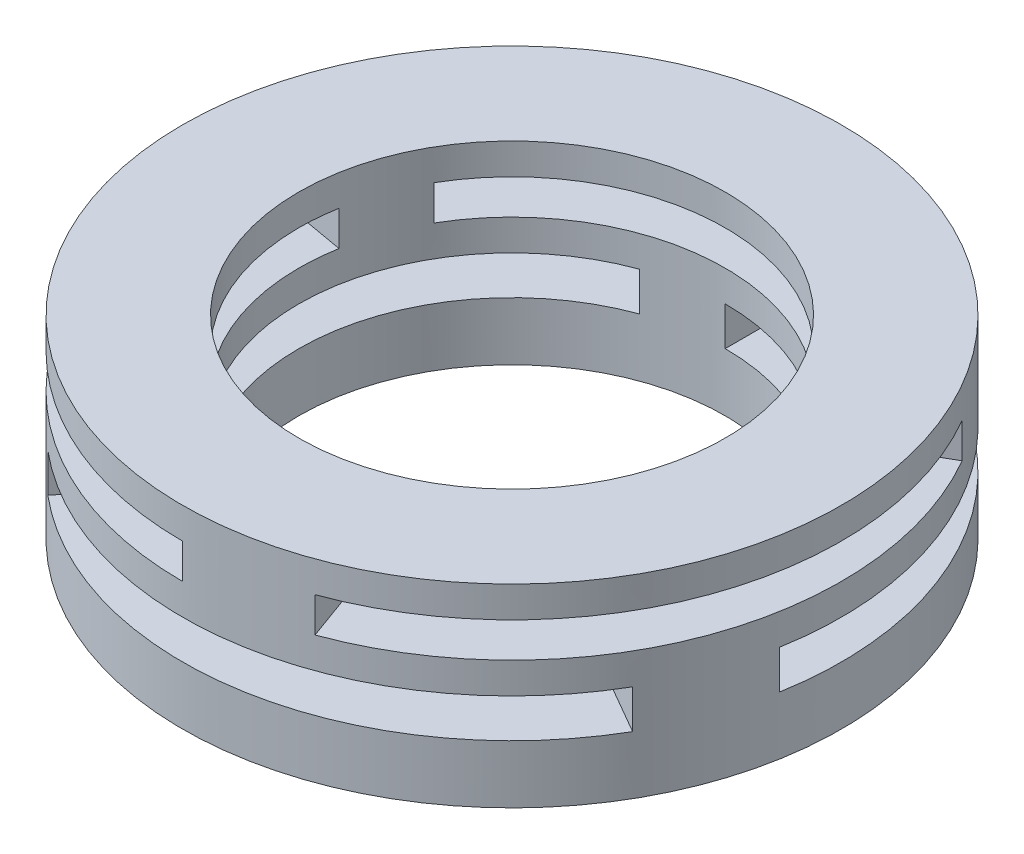
ISO-10303-21;
HEADER;
FILE_DESCRIPTION(('STEP AP214'),'2;1');
FILE_NAME('part.step','',(''),(''),'','','');
FILE_SCHEMA(('AUTOMOTIVE_DESIGN { 1 0 10303 214 1 1 1 1 }'));
ENDSEC;
DATA;
#1=APPLICATION_CONTEXT('core data for automotive mechanical design processes');
#2=APPLICATION_PROTOCOL_DEFINITION('international standard','automotive_design',2000,#1);
#3=PRODUCT_CONTEXT('',#1,'mechanical');
#4=PRODUCT('Part','Part','',(#3));
#5=PRODUCT_RELATED_PRODUCT_CATEGORY('part','',(#4));
#6=PRODUCT_DEFINITION_FORMATION('','',#4);
#7=PRODUCT_DEFINITION_CONTEXT('part definition',#1,'design');
#8=PRODUCT_DEFINITION('design','',#6,#7);
#9=PRODUCT_DEFINITION_SHAPE('','',#8);
#10=(LENGTH_UNIT() NAMED_UNIT(*) SI_UNIT(.MILLI.,.METRE.));
#11=(NAMED_UNIT(*) PLANE_ANGLE_UNIT() SI_UNIT($,.RADIAN.));
#12=(NAMED_UNIT(*) SI_UNIT($,.STERADIAN.) SOLID_ANGLE_UNIT());
#13=UNCERTAINTY_MEASURE_WITH_UNIT(LENGTH_MEASURE(1.E-05),#10,'distance_accuracy_value','');
#14=(GEOMETRIC_REPRESENTATION_CONTEXT(3) GLOBAL_UNCERTAINTY_ASSIGNED_CONTEXT((#13)) GLOBAL_UNIT_ASSIGNED_CONTEXT((#10,
#11,#12)) REPRESENTATION_CONTEXT('',''));
#15=CARTESIAN_POINT('',(0.,0.,0.));
#16=DIRECTION('',(0.,0.,1.));
#17=DIRECTION('',(1.,0.,0.));
#18=AXIS2_PLACEMENT_3D('',#15,#16,#17);
#19=CARTESIAN_POINT('',(3.86795134082924E-13,-112.760074912511,0.));
#20=DIRECTION('',(0.,1.,0.));
#21=DIRECTION('',(-1.,0.,0.));
#22=AXIS2_PLACEMENT_3D('',#19,#20,#21);
#23=CYLINDRICAL_SURFACE('',#22,5.50000000000001);
#24=DIRECTION('',(0.,1.,0.));
#25=VECTOR('',#24,1.);
#26=CARTESIAN_POINT('',(4.25264361886186E-13,-112.760074912511,5.50000000000001));
#27=LINE('',#26,#25);
#28=CARTESIAN_POINT('',(0.,4.19999999999998,5.50000000000001));
#29=VERTEX_POINT('',#28);
#30=CARTESIAN_POINT('',(0.,3.29999999999997,5.50000000000001));
#31=VERTEX_POINT('',#30);
#32=EDGE_CURVE('E239',#29,#31,#27,.F.);
#33=ORIENTED_EDGE('',*,*,#32,.F.);
#34=CARTESIAN_POINT('',(0.,4.19999999999998,0.));
#35=DIRECTION('',(0.,1.,0.));
#36=DIRECTION('',(-1.,0.,0.));
#37=AXIS2_PLACEMENT_3D('',#34,#35,#36);
#38=CIRCLE('',#37,5.50000000000001);
#39=CARTESIAN_POINT('',(-5.41644264156717,4.19999999999996,-0.955064977168101));
#40=VERTEX_POINT('',#39);
#41=EDGE_CURVE('E232',#29,#40,#38,.F.);
#42=ORIENTED_EDGE('',*,*,#41,.T.);
#43=DIRECTION('',(0.,1.,0.));
#44=VECTOR('',#43,1.);
#45=CARTESIAN_POINT('',(-5.41644264156677,-112.760074912511,-0.955064977168101));
#46=LINE('',#45,#44);
#47=CARTESIAN_POINT('',(-5.41644264156717,3.29999999999995,-0.955064977168101));
#48=VERTEX_POINT('',#47);
#49=EDGE_CURVE('E207',#48,#40,#46,.T.);
#50=ORIENTED_EDGE('',*,*,#49,.F.);
#51=CARTESIAN_POINT('',(0.,3.29999999999997,0.));
#52=DIRECTION('',(0.,1.,0.));
#53=DIRECTION('',(-1.,0.,0.));
#54=AXIS2_PLACEMENT_3D('',#51,#52,#53);
#55=CIRCLE('',#54,5.50000000000001);
#56=EDGE_CURVE('E227',#31,#48,#55,.F.);
#57=ORIENTED_EDGE('',*,*,#56,.F.);
#58=EDGE_LOOP('',(#33,#42,#50,#57));
#59=FACE_BOUND('',#58,.T.);
#60=DIRECTION('',(0.,1.,0.));
#61=VECTOR('',#60,1.);
#62=CARTESIAN_POINT('',(-4.76313972081404,-112.760074912511,-2.74999999999999));
#63=LINE('',#62,#61);
#64=CARTESIAN_POINT('',(-4.76313972081444,4.19999999999996,-2.74999999999999));
#65=VERTEX_POINT('',#64);
#66=CARTESIAN_POINT('',(-4.76313972081444,3.29999999999995,-2.74999999999999));
#67=VERTEX_POINT('',#66);
#68=EDGE_CURVE('E279',#65,#67,#63,.F.);
#69=ORIENTED_EDGE('',*,*,#68,.F.);
#70=CARTESIAN_POINT('',(0.,4.19999999999998,0.));
#71=DIRECTION('',(0.,1.,0.));
#72=DIRECTION('',(-1.,0.,0.));
#73=AXIS2_PLACEMENT_3D('',#70,#71,#72);
#74=CIRCLE('',#73,5.50000000000001);
#75=CARTESIAN_POINT('',(3.53533185327596,4.19999999999999,-4.21324443715438));
#76=VERTEX_POINT('',#75);
#77=EDGE_CURVE('E275',#65,#76,#74,.F.);
#78=ORIENTED_EDGE('',*,*,#77,.T.);
#79=DIRECTION('',(0.,1.,0.));
#80=VECTOR('',#79,1.);
#81=CARTESIAN_POINT('',(3.53533185327636,-112.760074912511,-4.21324443715438));
#82=LINE('',#81,#80);
#83=CARTESIAN_POINT('',(3.53533185327597,3.29999999999998,-4.21324443715438));
#84=VERTEX_POINT('',#83);
#85=EDGE_CURVE('E283',#84,#76,#82,.T.);
#86=ORIENTED_EDGE('',*,*,#85,.F.);
#87=CARTESIAN_POINT('',(0.,3.29999999999997,0.));
#88=DIRECTION('',(0.,1.,0.));
#89=DIRECTION('',(-1.,0.,0.));
#90=AXIS2_PLACEMENT_3D('',#87,#88,#89);
#91=CIRCLE('',#90,5.50000000000001);
#92=EDGE_CURVE('E272',#67,#84,#91,.F.);
#93=ORIENTED_EDGE('',*,*,#92,.F.);
#94=EDGE_LOOP('',(#69,#78,#86,#93));
#95=FACE_BOUND('',#94,.T.);
#96=DIRECTION('',(0.,1.,0.));
#97=VECTOR('',#96,1.);
#98=CARTESIAN_POINT('',(4.76313972081481,-112.760074912511,-2.74999999999999));
#99=LINE('',#98,#97);
#100=CARTESIAN_POINT('',(4.76313972081441,4.2,-2.74999999999999));
#101=VERTEX_POINT('',#100);
#102=CARTESIAN_POINT('',(4.76313972081442,3.29999999999999,-2.74999999999999));
#103=VERTEX_POINT('',#102);
#104=EDGE_CURVE('E321',#101,#103,#99,.F.);
#105=ORIENTED_EDGE('',*,*,#104,.F.);
#106=CARTESIAN_POINT('',(0.,4.19999999999998,0.));
#107=DIRECTION('',(0.,1.,0.));
#108=DIRECTION('',(-1.,0.,0.));
#109=AXIS2_PLACEMENT_3D('',#106,#107,#108);
#110=CIRCLE('',#109,5.50000000000001);
#111=CARTESIAN_POINT('',(1.88111078829114,4.19999999999999,5.16830941432251));
#112=VERTEX_POINT('',#111);
#113=EDGE_CURVE('E317',#101,#112,#110,.F.);
#114=ORIENTED_EDGE('',*,*,#113,.T.);
#115=DIRECTION('',(0.,1.,0.));
#116=VECTOR('',#115,1.);
#117=CARTESIAN_POINT('',(1.88111078829154,-112.760074912511,5.16830941432251));
#118=LINE('',#117,#116);
#119=CARTESIAN_POINT('',(1.88111078829114,3.29999999999998,5.16830941432251));
#120=VERTEX_POINT('',#119);
#121=EDGE_CURVE('E325',#120,#112,#118,.T.);
#122=ORIENTED_EDGE('',*,*,#121,.F.);
#123=CARTESIAN_POINT('',(0.,3.29999999999997,0.));
#124=DIRECTION('',(0.,1.,0.));
#125=DIRECTION('',(-1.,0.,0.));
#126=AXIS2_PLACEMENT_3D('',#123,#124,#125);
#127=CIRCLE('',#126,5.50000000000001);
#128=EDGE_CURVE('E314',#103,#120,#127,.F.);
#129=ORIENTED_EDGE('',*,*,#128,.F.);
#130=EDGE_LOOP('',(#105,#114,#122,#129));
#131=FACE_BOUND('',#130,.T.);
#132=DIRECTION('',(0.,-1.,0.));
#133=VECTOR('',#132,1.);
#134=CARTESIAN_POINT('',(4.76313972081444,2.49999999999999,2.74999999999996));
#135=LINE('',#134,#133);
#136=CARTESIAN_POINT('',(4.76313972081444,2.49999999999999,2.74999999999996));
#137=VERTEX_POINT('',#136);
#138=CARTESIAN_POINT('',(4.76313972081444,1.49999999999999,2.74999999999996));
#139=VERTEX_POINT('',#138);
#140=EDGE_CURVE('E364',#137,#139,#135,.T.);
#141=ORIENTED_EDGE('',*,*,#140,.F.);
#142=CARTESIAN_POINT('',(0.,2.49999999999998,0.));
#143=DIRECTION('',(0.,-1.,0.));
#144=DIRECTION('',(0.499999999999992,0.,-0.866025403784443));
#145=AXIS2_PLACEMENT_3D('',#142,#143,#144);
#146=CIRCLE('',#145,5.50000000000002);
#147=CARTESIAN_POINT('',(-3.53533185327593,2.49999999999996,4.21324443715444));
#148=VERTEX_POINT('',#147);
#149=EDGE_CURVE('E337',#137,#148,#146,.T.);
#150=ORIENTED_EDGE('',*,*,#149,.T.);
#151=DIRECTION('',(0.,-1.,0.));
#152=VECTOR('',#151,1.);
#153=CARTESIAN_POINT('',(-3.53533185327593,2.49999999999996,4.21324443715444));
#154=LINE('',#153,#152);
#155=CARTESIAN_POINT('',(-3.53533185327593,1.49999999999996,4.21324443715444));
#156=VERTEX_POINT('',#155);
#157=EDGE_CURVE('E360',#148,#156,#154,.T.);
#158=ORIENTED_EDGE('',*,*,#157,.T.);
#159=CARTESIAN_POINT('',(0.,1.49999999999998,0.));
#160=DIRECTION('',(0.,-1.,0.));
#161=DIRECTION('',(0.499999999999992,0.,-0.866025403784443));
#162=AXIS2_PLACEMENT_3D('',#159,#160,#161);
#163=CIRCLE('',#162,5.50000000000002);
#164=EDGE_CURVE('E352',#139,#156,#163,.T.);
#165=ORIENTED_EDGE('',*,*,#164,.F.);
#166=EDGE_LOOP('',(#141,#150,#158,#165));
#167=FACE_BOUND('',#166,.T.);
#168=DIRECTION('',(0.,-1.,0.));
#169=VECTOR('',#168,1.);
#170=CARTESIAN_POINT('',(-4.76313972081442,2.49999999999996,2.75000000000003));
#171=LINE('',#170,#169);
#172=CARTESIAN_POINT('',(-4.76313972081442,2.49999999999996,2.75000000000003));
#173=VERTEX_POINT('',#172);
#174=CARTESIAN_POINT('',(-4.76313972081441,1.49999999999996,2.75000000000003));
#175=VERTEX_POINT('',#174);
#176=EDGE_CURVE('E407',#173,#175,#171,.T.);
#177=ORIENTED_EDGE('',*,*,#176,.F.);
#178=CARTESIAN_POINT('',(0.,2.49999999999998,0.));
#179=DIRECTION('',(0.,-1.,0.));
#180=DIRECTION('',(0.500000000000004,0.,0.866025403784436));
#181=AXIS2_PLACEMENT_3D('',#178,#179,#180);
#182=CIRCLE('',#181,5.50000000000002);
#183=CARTESIAN_POINT('',(-1.88111078829124,2.49999999999997,-5.1683094143225));
#184=VERTEX_POINT('',#183);
#185=EDGE_CURVE('E380',#173,#184,#182,.T.);
#186=ORIENTED_EDGE('',*,*,#185,.T.);
#187=DIRECTION('',(0.,-1.,0.));
#188=VECTOR('',#187,1.);
#189=CARTESIAN_POINT('',(-1.88111078829124,2.49999999999997,-5.1683094143225));
#190=LINE('',#189,#188);
#191=CARTESIAN_POINT('',(-1.88111078829123,1.49999999999997,-5.1683094143225));
#192=VERTEX_POINT('',#191);
#193=EDGE_CURVE('E403',#184,#192,#190,.T.);
#194=ORIENTED_EDGE('',*,*,#193,.T.);
#195=CARTESIAN_POINT('',(0.,1.49999999999998,0.));
#196=DIRECTION('',(0.,-1.,0.));
#197=DIRECTION('',(0.500000000000004,0.,0.866025403784436));
#198=AXIS2_PLACEMENT_3D('',#195,#196,#197);
#199=CIRCLE('',#198,5.50000000000002);
#200=EDGE_CURVE('E395',#175,#192,#199,.T.);
#201=ORIENTED_EDGE('',*,*,#200,.F.);
#202=EDGE_LOOP('',(#177,#186,#194,#201));
#203=FACE_BOUND('',#202,.T.);
#204=DIRECTION('',(0.,-1.,0.));
#205=VECTOR('',#204,1.);
#206=CARTESIAN_POINT('',(0.,2.49999999999998,-5.50000000000002));
#207=LINE('',#206,#205);
#208=CARTESIAN_POINT('',(0.,2.49999999999998,-5.50000000000002));
#209=VERTEX_POINT('',#208);
#210=CARTESIAN_POINT('',(0.,1.49999999999997,-5.50000000000001));
#211=VERTEX_POINT('',#210);
#212=EDGE_CURVE('E450',#209,#211,#207,.T.);
#213=ORIENTED_EDGE('',*,*,#212,.F.);
#214=CARTESIAN_POINT('',(0.,2.49999999999998,0.));
#215=DIRECTION('',(0.,-1.,0.));
#216=DIRECTION('',(-1.,0.,0.));
#217=AXIS2_PLACEMENT_3D('',#214,#215,#216);
#218=CIRCLE('',#217,5.50000000000002);
#219=CARTESIAN_POINT('',(5.41644264156716,2.49999999999999,0.955064977168098));
#220=VERTEX_POINT('',#219);
#221=EDGE_CURVE('E423',#209,#220,#218,.T.);
#222=ORIENTED_EDGE('',*,*,#221,.T.);
#223=DIRECTION('',(0.,-1.,0.));
#224=VECTOR('',#223,1.);
#225=CARTESIAN_POINT('',(5.41644264156716,2.49999999999999,0.955064977168098));
#226=LINE('',#225,#224);
#227=CARTESIAN_POINT('',(5.41644264156716,1.49999999999999,0.955064977168098));
#228=VERTEX_POINT('',#227);
#229=EDGE_CURVE('E446',#220,#228,#226,.T.);
#230=ORIENTED_EDGE('',*,*,#229,.T.);
#231=CARTESIAN_POINT('',(0.,1.49999999999998,0.));
#232=DIRECTION('',(0.,-1.,0.));
#233=DIRECTION('',(-1.,0.,0.));
#234=AXIS2_PLACEMENT_3D('',#231,#232,#233);
#235=CIRCLE('',#234,5.50000000000002);
#236=EDGE_CURVE('E438',#211,#228,#235,.T.);
#237=ORIENTED_EDGE('',*,*,#236,.F.);
#238=EDGE_LOOP('',(#213,#222,#230,#237));
#239=FACE_BOUND('',#238,.T.);
#240=CARTESIAN_POINT('',(0.,0.,0.));
#241=DIRECTION('',(0.,1.,0.));
#242=DIRECTION('',(-1.,0.,0.));
#243=AXIS2_PLACEMENT_3D('',#240,#241,#242);
#244=CIRCLE('',#243,5.5);
#245=CARTESIAN_POINT('',(-5.5,0.,0.));
#246=VERTEX_POINT('',#245);
#247=EDGE_CURVE('E11',#246,#246,#244,.T.);
#248=ORIENTED_EDGE('',*,*,#247,.F.);
#249=EDGE_LOOP('',(#248));
#250=FACE_BOUND('',#249,.T.);
#251=CARTESIAN_POINT('',(0.,4.99999999999999,0.));
#252=DIRECTION('',(0.,1.,0.));
#253=DIRECTION('',(-1.,0.,0.));
#254=AXIS2_PLACEMENT_3D('',#251,#252,#253);
#255=CIRCLE('',#254,5.50000000000002);
#256=CARTESIAN_POINT('',(-5.50000000000003,4.99999999999997,0.));
#257=VERTEX_POINT('',#256);
#258=EDGE_CURVE('E457',#257,#257,#255,.T.);
#259=ORIENTED_EDGE('',*,*,#258,.T.);
#260=EDGE_LOOP('',(#259));
#261=FACE_BOUND('',#260,.T.);
#262=ADVANCED_FACE('F43',(#59,#95,#131,#167,#203,#239,#250,#261),#23,.F.);
#263=CARTESIAN_POINT('',(5.5,0.,0.));
#264=DIRECTION('',(0.,1.,0.));
#265=DIRECTION('',(-1.,0.,0.));
#266=AXIS2_PLACEMENT_3D('',#263,#264,#265);
#267=PLANE('',#266);
#268=CARTESIAN_POINT('',(0.,0.,0.));
#269=DIRECTION('',(0.,1.,0.));
#270=DIRECTION('',(-1.,0.,0.));
#271=AXIS2_PLACEMENT_3D('',#268,#269,#270);
#272=CIRCLE('',#271,8.5);
#273=CARTESIAN_POINT('',(-8.5,0.,0.));
#274=VERTEX_POINT('',#273);
#275=EDGE_CURVE('E51',#274,#274,#272,.T.);
#276=ORIENTED_EDGE('',*,*,#275,.F.);
#277=EDGE_LOOP('',(#276));
#278=FACE_BOUND('',#277,.T.);
#279=ORIENTED_EDGE('',*,*,#247,.T.);
#280=EDGE_LOOP('',(#279));
#281=FACE_BOUND('',#280,.T.);
#282=ADVANCED_FACE('F469',(#278,#281),#267,.F.);
#283=CARTESIAN_POINT('',(3.86795134082924E-13,-112.760074912511,0.));
#284=DIRECTION('',(0.,1.,0.));
#285=DIRECTION('',(-1.,0.,0.));
#286=AXIS2_PLACEMENT_3D('',#283,#284,#285);
#287=CYLINDRICAL_SURFACE('',#286,8.50000000000001);
#288=DIRECTION('',(0.,-1.,0.));
#289=VECTOR('',#288,1.);
#290=CARTESIAN_POINT('',(-8.37086590060381,4.19999999999995,-1.47600951016888));
#291=LINE('',#290,#289);
#292=CARTESIAN_POINT('',(-8.37086590060381,4.19999999999995,-1.47600951016888));
#293=VERTEX_POINT('',#292);
#294=CARTESIAN_POINT('',(-8.37086590060379,3.29999999999994,-1.47600951016888));
#295=VERTEX_POINT('',#294);
#296=EDGE_CURVE('E66',#293,#295,#291,.T.);
#297=ORIENTED_EDGE('',*,*,#296,.F.);
#298=CARTESIAN_POINT('',(0.,4.19999999999998,0.));
#299=DIRECTION('',(0.,1.,0.));
#300=DIRECTION('',(0.499999999999992,0.,-0.866025403784443));
#301=AXIS2_PLACEMENT_3D('',#298,#299,#300);
#302=CIRCLE('',#301,8.50000000000002);
#303=CARTESIAN_POINT('',(0.,4.19999999999998,8.50000000000002));
#304=VERTEX_POINT('',#303);
#305=EDGE_CURVE('E211',#293,#304,#302,.T.);
#306=ORIENTED_EDGE('',*,*,#305,.T.);
#307=DIRECTION('',(0.,-1.,0.));
#308=VECTOR('',#307,1.);
#309=CARTESIAN_POINT('',(0.,4.19999999999998,8.50000000000002));
#310=LINE('',#309,#308);
#311=CARTESIAN_POINT('',(0.,3.29999999999998,8.50000000000002));
#312=VERTEX_POINT('',#311);
#313=EDGE_CURVE('E228',#304,#312,#310,.T.);
#314=ORIENTED_EDGE('',*,*,#313,.T.);
#315=CARTESIAN_POINT('',(0.,3.29999999999998,0.));
#316=DIRECTION('',(0.,1.,0.));
#317=DIRECTION('',(0.499999999999992,0.,-0.866025403784443));
#318=AXIS2_PLACEMENT_3D('',#315,#316,#317);
#319=CIRCLE('',#318,8.50000000000002);
#320=EDGE_CURVE('E225',#295,#312,#319,.T.);
#321=ORIENTED_EDGE('',*,*,#320,.F.);
#322=EDGE_LOOP('',(#297,#306,#314,#321));
#323=FACE_BOUND('',#322,.T.);
#324=DIRECTION('',(0.,-1.,0.));
#325=VECTOR('',#324,1.);
#326=CARTESIAN_POINT('',(5.46369468233559,4.19999999999999,-6.51137776651132));
#327=LINE('',#326,#325);
#328=CARTESIAN_POINT('',(5.46369468233559,4.19999999999999,-6.51137776651132));
#329=VERTEX_POINT('',#328);
#330=CARTESIAN_POINT('',(5.46369468233559,3.29999999999999,-6.51137776651131));
#331=VERTEX_POINT('',#330);
#332=EDGE_CURVE('E269',#329,#331,#327,.T.);
#333=ORIENTED_EDGE('',*,*,#332,.F.);
#334=CARTESIAN_POINT('',(0.,4.19999999999998,0.));
#335=DIRECTION('',(0.,1.,0.));
#336=DIRECTION('',(0.500000000000004,0.,0.866025403784436));
#337=AXIS2_PLACEMENT_3D('',#334,#335,#336);
#338=CIRCLE('',#337,8.50000000000002);
#339=CARTESIAN_POINT('',(-7.36121593216777,4.19999999999995,-4.24999999999999));
#340=VERTEX_POINT('',#339);
#341=EDGE_CURVE('E248',#329,#340,#338,.T.);
#342=ORIENTED_EDGE('',*,*,#341,.T.);
#343=DIRECTION('',(0.,-1.,0.));
#344=VECTOR('',#343,1.);
#345=CARTESIAN_POINT('',(-7.36121593216777,4.19999999999995,-4.24999999999999));
#346=LINE('',#345,#344);
#347=CARTESIAN_POINT('',(-7.36121593216777,3.29999999999995,-4.24999999999999));
#348=VERTEX_POINT('',#347);
#349=EDGE_CURVE('E257',#340,#348,#346,.T.);
#350=ORIENTED_EDGE('',*,*,#349,.T.);
#351=CARTESIAN_POINT('',(0.,3.29999999999998,0.));
#352=DIRECTION('',(0.,1.,0.));
#353=DIRECTION('',(0.500000000000004,0.,0.866025403784436));
#354=AXIS2_PLACEMENT_3D('',#351,#352,#353);
#355=CIRCLE('',#354,8.50000000000002);
#356=EDGE_CURVE('E261',#331,#348,#355,.T.);
#357=ORIENTED_EDGE('',*,*,#356,.F.);
#358=EDGE_LOOP('',(#333,#342,#350,#357));
#359=FACE_BOUND('',#358,.T.);
#360=DIRECTION('',(0.,-1.,0.));
#361=VECTOR('',#360,1.);
#362=CARTESIAN_POINT('',(2.90717121826813,4.19999999999999,7.98738727668026));
#363=LINE('',#362,#361);
#364=CARTESIAN_POINT('',(2.90717121826813,4.19999999999999,7.98738727668026));
#365=VERTEX_POINT('',#364);
#366=CARTESIAN_POINT('',(2.90717121826813,3.29999999999998,7.98738727668025));
#367=VERTEX_POINT('',#366);
#368=EDGE_CURVE('E311',#365,#367,#363,.T.);
#369=ORIENTED_EDGE('',*,*,#368,.F.);
#370=CARTESIAN_POINT('',(0.,4.19999999999998,0.));
#371=DIRECTION('',(0.,1.,0.));
#372=DIRECTION('',(-1.,0.,0.));
#373=AXIS2_PLACEMENT_3D('',#370,#371,#372);
#374=CIRCLE('',#373,8.50000000000002);
#375=CARTESIAN_POINT('',(7.36121593216774,4.2,-4.24999999999999));
#376=VERTEX_POINT('',#375);
#377=EDGE_CURVE('E290',#365,#376,#374,.T.);
#378=ORIENTED_EDGE('',*,*,#377,.T.);
#379=DIRECTION('',(0.,-1.,0.));
#380=VECTOR('',#379,1.);
#381=CARTESIAN_POINT('',(7.36121593216774,4.2,-4.24999999999999));
#382=LINE('',#381,#380);
#383=CARTESIAN_POINT('',(7.36121593216774,3.3,-4.24999999999999));
#384=VERTEX_POINT('',#383);
#385=EDGE_CURVE('E299',#376,#384,#382,.T.);
#386=ORIENTED_EDGE('',*,*,#385,.T.);
#387=CARTESIAN_POINT('',(0.,3.29999999999998,0.));
#388=DIRECTION('',(0.,1.,0.));
#389=DIRECTION('',(-1.,0.,0.));
#390=AXIS2_PLACEMENT_3D('',#387,#388,#389);
#391=CIRCLE('',#390,8.50000000000002);
#392=EDGE_CURVE('E303',#367,#384,#391,.T.);
#393=ORIENTED_EDGE('',*,*,#392,.F.);
#394=EDGE_LOOP('',(#369,#378,#386,#393));
#395=FACE_BOUND('',#394,.T.);
#396=DIRECTION('',(0.,-1.,0.));
#397=VECTOR('',#396,1.);
#398=CARTESIAN_POINT('',(-5.46369468233552,2.49999999999996,6.5113777665114));
#399=LINE('',#398,#397);
#400=CARTESIAN_POINT('',(-5.46369468233552,2.49999999999996,6.5113777665114));
#401=VERTEX_POINT('',#400);
#402=CARTESIAN_POINT('',(-5.46369468233551,1.49999999999995,6.51137776651139));
#403=VERTEX_POINT('',#402);
#404=EDGE_CURVE('E344',#401,#403,#399,.T.);
#405=ORIENTED_EDGE('',*,*,#404,.F.);
#406=CARTESIAN_POINT('',(0.,2.49999999999998,0.));
#407=DIRECTION('',(0.,1.,0.));
#408=DIRECTION('',(0.499999999999992,0.,-0.866025403784443));
#409=AXIS2_PLACEMENT_3D('',#406,#407,#408);
#410=CIRCLE('',#409,8.50000000000002);
#411=CARTESIAN_POINT('',(7.36121593216777,2.5,4.24999999999994));
#412=VERTEX_POINT('',#411);
#413=EDGE_CURVE('E329',#401,#412,#410,.T.);
#414=ORIENTED_EDGE('',*,*,#413,.T.);
#415=DIRECTION('',(0.,-1.,0.));
#416=VECTOR('',#415,1.);
#417=CARTESIAN_POINT('',(7.36121593216777,2.5,4.24999999999994));
#418=LINE('',#417,#416);
#419=CARTESIAN_POINT('',(7.36121593216778,1.5,4.24999999999994));
#420=VERTEX_POINT('',#419);
#421=EDGE_CURVE('E367',#412,#420,#418,.T.);
#422=ORIENTED_EDGE('',*,*,#421,.T.);
#423=CARTESIAN_POINT('',(0.,1.49999999999998,0.));
#424=DIRECTION('',(0.,1.,0.));
#425=DIRECTION('',(0.499999999999992,0.,-0.866025403784443));
#426=AXIS2_PLACEMENT_3D('',#423,#424,#425);
#427=CIRCLE('',#426,8.50000000000002);
#428=EDGE_CURVE('E328',#403,#420,#427,.T.);
#429=ORIENTED_EDGE('',*,*,#428,.F.);
#430=EDGE_LOOP('',(#405,#414,#422,#429));
#431=FACE_BOUND('',#430,.T.);
#432=DIRECTION('',(0.,-1.,0.));
#433=VECTOR('',#432,1.);
#434=CARTESIAN_POINT('',(-2.90717121826827,2.49999999999997,-7.98738727668022));
#435=LINE('',#434,#433);
#436=CARTESIAN_POINT('',(-2.90717121826827,2.49999999999997,-7.98738727668022));
#437=VERTEX_POINT('',#436);
#438=CARTESIAN_POINT('',(-2.90717121826826,1.49999999999996,-7.9873872766802));
#439=VERTEX_POINT('',#438);
#440=EDGE_CURVE('E387',#437,#439,#435,.T.);
#441=ORIENTED_EDGE('',*,*,#440,.F.);
#442=CARTESIAN_POINT('',(0.,2.49999999999998,0.));
#443=DIRECTION('',(0.,1.,0.));
#444=DIRECTION('',(0.500000000000004,0.,0.866025403784436));
#445=AXIS2_PLACEMENT_3D('',#442,#443,#444);
#446=CIRCLE('',#445,8.50000000000002);
#447=CARTESIAN_POINT('',(-7.36121593216773,2.49999999999995,4.25000000000004));
#448=VERTEX_POINT('',#447);
#449=EDGE_CURVE('E372',#437,#448,#446,.T.);
#450=ORIENTED_EDGE('',*,*,#449,.T.);
#451=DIRECTION('',(0.,-1.,0.));
#452=VECTOR('',#451,1.);
#453=CARTESIAN_POINT('',(-7.36121593216773,2.49999999999995,4.25000000000004));
#454=LINE('',#453,#452);
#455=CARTESIAN_POINT('',(-7.36121593216773,1.49999999999995,4.25000000000004));
#456=VERTEX_POINT('',#455);
#457=EDGE_CURVE('E410',#448,#456,#454,.T.);
#458=ORIENTED_EDGE('',*,*,#457,.T.);
#459=CARTESIAN_POINT('',(0.,1.49999999999998,0.));
#460=DIRECTION('',(0.,1.,0.));
#461=DIRECTION('',(0.500000000000004,0.,0.866025403784436));
#462=AXIS2_PLACEMENT_3D('',#459,#460,#461);
#463=CIRCLE('',#462,8.50000000000002);
#464=EDGE_CURVE('E371',#439,#456,#463,.T.);
#465=ORIENTED_EDGE('',*,*,#464,.F.);
#466=EDGE_LOOP('',(#441,#450,#458,#465));
#467=FACE_BOUND('',#466,.T.);
#468=DIRECTION('',(0.,-1.,0.));
#469=VECTOR('',#468,1.);
#470=CARTESIAN_POINT('',(8.37086590060378,2.5,1.47600951016888));
#471=LINE('',#470,#469);
#472=CARTESIAN_POINT('',(8.37086590060378,2.5,1.47600951016888));
#473=VERTEX_POINT('',#472);
#474=CARTESIAN_POINT('',(8.37086590060378,1.5,1.47600951016888));
#475=VERTEX_POINT('',#474);
#476=EDGE_CURVE('E430',#473,#475,#471,.T.);
#477=ORIENTED_EDGE('',*,*,#476,.F.);
#478=CARTESIAN_POINT('',(0.,2.49999999999998,0.));
#479=DIRECTION('',(0.,1.,0.));
#480=DIRECTION('',(-1.,0.,0.));
#481=AXIS2_PLACEMENT_3D('',#478,#479,#480);
#482=CIRCLE('',#481,8.50000000000002);
#483=CARTESIAN_POINT('',(0.,2.49999999999998,-8.50000000000002));
#484=VERTEX_POINT('',#483);
#485=EDGE_CURVE('E415',#473,#484,#482,.T.);
#486=ORIENTED_EDGE('',*,*,#485,.T.);
#487=DIRECTION('',(0.,-1.,0.));
#488=VECTOR('',#487,1.);
#489=CARTESIAN_POINT('',(0.,2.49999999999998,-8.50000000000002));
#490=LINE('',#489,#488);
#491=CARTESIAN_POINT('',(0.,1.49999999999998,-8.50000000000002));
#492=VERTEX_POINT('',#491);
#493=EDGE_CURVE('E453',#484,#492,#490,.T.);
#494=ORIENTED_EDGE('',*,*,#493,.T.);
#495=CARTESIAN_POINT('',(0.,1.49999999999998,0.));
#496=DIRECTION('',(0.,1.,0.));
#497=DIRECTION('',(-1.,0.,0.));
#498=AXIS2_PLACEMENT_3D('',#495,#496,#497);
#499=CIRCLE('',#498,8.50000000000002);
#500=EDGE_CURVE('E414',#475,#492,#499,.T.);
#501=ORIENTED_EDGE('',*,*,#500,.F.);
#502=EDGE_LOOP('',(#477,#486,#494,#501));
#503=FACE_BOUND('',#502,.T.);
#504=CARTESIAN_POINT('',(0.,4.99999999999998,0.));
#505=DIRECTION('',(0.,1.,0.));
#506=DIRECTION('',(-1.,0.,0.));
#507=AXIS2_PLACEMENT_3D('',#504,#505,#506);
#508=CIRCLE('',#507,8.50000000000002);
#509=CARTESIAN_POINT('',(-8.50000000000004,4.99999999999995,0.));
#510=VERTEX_POINT('',#509);
#511=EDGE_CURVE('E461',#510,#510,#508,.T.);
#512=ORIENTED_EDGE('',*,*,#511,.F.);
#513=EDGE_LOOP('',(#512));
#514=FACE_BOUND('',#513,.T.);
#515=ORIENTED_EDGE('',*,*,#275,.T.);
#516=EDGE_LOOP('',(#515));
#517=FACE_BOUND('',#516,.T.);
#518=ADVANCED_FACE('F223',(#323,#359,#395,#431,#467,#503,#514,#517),#287,.T.);
#519=CARTESIAN_POINT('',(8.5,5.00000000000001,0.));
#520=DIRECTION('',(0.,-1.,0.));
#521=DIRECTION('',(1.,0.,0.));
#522=AXIS2_PLACEMENT_3D('',#519,#520,#521);
#523=PLANE('',#522);
#524=ORIENTED_EDGE('',*,*,#258,.F.);
#525=EDGE_LOOP('',(#524));
#526=FACE_BOUND('',#525,.T.);
#527=ORIENTED_EDGE('',*,*,#511,.T.);
#528=EDGE_LOOP('',(#527));
#529=FACE_BOUND('',#528,.T.);
#530=ADVANCED_FACE('F479',(#526,#529),#523,.F.);
#531=CARTESIAN_POINT('',(0.,2.49999999999998,-8.50000000000002));
#532=DIRECTION('',(1.,0.,0.));
#533=DIRECTION('',(0.,1.,0.));
#534=AXIS2_PLACEMENT_3D('',#531,#532,#533);
#535=PLANE('',#534);
#536=DIRECTION('',(0.,0.,1.));
#537=VECTOR('',#536,1.);
#538=CARTESIAN_POINT('',(0.,1.49999999999998,-8.50000000000002));
#539=LINE('',#538,#537);
#540=EDGE_CURVE('E434',#492,#211,#539,.T.);
#541=ORIENTED_EDGE('',*,*,#540,.F.);
#542=ORIENTED_EDGE('',*,*,#493,.F.);
#543=DIRECTION('',(0.,0.,1.));
#544=VECTOR('',#543,1.);
#545=CARTESIAN_POINT('',(0.,2.49999999999998,-8.50000000000002));
#546=LINE('',#545,#544);
#547=EDGE_CURVE('E419',#484,#209,#546,.T.);
#548=ORIENTED_EDGE('',*,*,#547,.T.);
#549=ORIENTED_EDGE('',*,*,#212,.T.);
#550=EDGE_LOOP('',(#541,#542,#548,#549));
#551=FACE_BOUND('',#550,.T.);
#552=ADVANCED_FACE('F482',(#551),#535,.T.);
#553=CARTESIAN_POINT('',(5.41644264156716,2.49999999999999,0.955064977168098));
#554=DIRECTION('',(0.173648177666927,0.,-0.984807753012209));
#555=DIRECTION('',(-0.984807753012209,0.,-0.173648177666927));
#556=AXIS2_PLACEMENT_3D('',#553,#554,#555);
#557=PLANE('',#556);
#558=DIRECTION('',(0.984807753012209,0.,0.173648177666926));
#559=VECTOR('',#558,1.);
#560=CARTESIAN_POINT('',(5.41644264156716,1.49999999999999,0.955064977168098));
#561=LINE('',#560,#559);
#562=EDGE_CURVE('E420',#228,#475,#561,.T.);
#563=ORIENTED_EDGE('',*,*,#562,.F.);
#564=ORIENTED_EDGE('',*,*,#229,.F.);
#565=DIRECTION('',(0.984807753012209,0.,0.173648177666926));
#566=VECTOR('',#565,1.);
#567=CARTESIAN_POINT('',(5.41644264156716,2.49999999999999,0.955064977168098));
#568=LINE('',#567,#566);
#569=EDGE_CURVE('E427',#220,#473,#568,.T.);
#570=ORIENTED_EDGE('',*,*,#569,.T.);
#571=ORIENTED_EDGE('',*,*,#476,.T.);
#572=EDGE_LOOP('',(#563,#564,#570,#571));
#573=FACE_BOUND('',#572,.T.);
#574=ADVANCED_FACE('F493',(#573),#557,.T.);
#575=CARTESIAN_POINT('',(0.,2.49999999999998,0.));
#576=DIRECTION('',(0.,1.,0.));
#577=DIRECTION('',(-1.,0.,0.));
#578=AXIS2_PLACEMENT_3D('',#575,#576,#577);
#579=PLANE('',#578);
#580=ORIENTED_EDGE('',*,*,#485,.F.);
#581=ORIENTED_EDGE('',*,*,#569,.F.);
#582=ORIENTED_EDGE('',*,*,#221,.F.);
#583=ORIENTED_EDGE('',*,*,#547,.F.);
#584=EDGE_LOOP('',(#580,#581,#582,#583));
#585=FACE_BOUND('',#584,.T.);
#586=ADVANCED_FACE('F497',(#585),#579,.F.);
#587=CARTESIAN_POINT('',(0.,1.49999999999998,0.));
#588=DIRECTION('',(0.,1.,0.));
#589=DIRECTION('',(-1.,0.,0.));
#590=AXIS2_PLACEMENT_3D('',#587,#588,#589);
#591=PLANE('',#590);
#592=ORIENTED_EDGE('',*,*,#500,.T.);
#593=ORIENTED_EDGE('',*,*,#540,.T.);
#594=ORIENTED_EDGE('',*,*,#236,.T.);
#595=ORIENTED_EDGE('',*,*,#562,.T.);
#596=EDGE_LOOP('',(#592,#593,#594,#595));
#597=FACE_BOUND('',#596,.T.);
#598=ADVANCED_FACE('F499',(#597),#591,.T.);
#599=CARTESIAN_POINT('',(-7.36121593216773,2.49999999999995,4.25000000000004));
#600=DIRECTION('',(-0.500000000000004,0.,-0.866025403784436));
#601=DIRECTION('',(-0.866025403784436,0.,0.500000000000004));
#602=AXIS2_PLACEMENT_3D('',#599,#600,#601);
#603=PLANE('',#602);
#604=DIRECTION('',(0.866025403784436,0.,-0.500000000000004));
#605=VECTOR('',#604,1.);
#606=CARTESIAN_POINT('',(-7.36121593216773,1.49999999999995,4.25000000000004));
#607=LINE('',#606,#605);
#608=EDGE_CURVE('E391',#456,#175,#607,.T.);
#609=ORIENTED_EDGE('',*,*,#608,.F.);
#610=ORIENTED_EDGE('',*,*,#457,.F.);
#611=DIRECTION('',(0.866025403784436,0.,-0.500000000000004));
#612=VECTOR('',#611,1.);
#613=CARTESIAN_POINT('',(-7.36121593216773,2.49999999999995,4.25000000000004));
#614=LINE('',#613,#612);
#615=EDGE_CURVE('E376',#448,#173,#614,.T.);
#616=ORIENTED_EDGE('',*,*,#615,.T.);
#617=ORIENTED_EDGE('',*,*,#176,.T.);
#618=EDGE_LOOP('',(#609,#610,#616,#617));
#619=FACE_BOUND('',#618,.T.);
#620=ADVANCED_FACE('F502',(#619),#603,.T.);
#621=CARTESIAN_POINT('',(-1.88111078829124,2.49999999999997,-5.1683094143225));
#622=DIRECTION('',(-0.939692620785906,0.,0.342020143325677));
#623=DIRECTION('',(0.342020143325677,0.,0.939692620785906));
#624=AXIS2_PLACEMENT_3D('',#621,#622,#623);
#625=PLANE('',#624);
#626=DIRECTION('',(-0.342020143325677,0.,-0.939692620785906));
#627=VECTOR('',#626,1.);
#628=CARTESIAN_POINT('',(-1.88111078829123,1.49999999999997,-5.1683094143225));
#629=LINE('',#628,#627);
#630=EDGE_CURVE('E377',#192,#439,#629,.T.);
#631=ORIENTED_EDGE('',*,*,#630,.F.);
#632=ORIENTED_EDGE('',*,*,#193,.F.);
#633=DIRECTION('',(-0.342020143325677,0.,-0.939692620785906));
#634=VECTOR('',#633,1.);
#635=CARTESIAN_POINT('',(-1.88111078829124,2.49999999999997,-5.1683094143225));
#636=LINE('',#635,#634);
#637=EDGE_CURVE('E384',#184,#437,#636,.T.);
#638=ORIENTED_EDGE('',*,*,#637,.T.);
#639=ORIENTED_EDGE('',*,*,#440,.T.);
#640=EDGE_LOOP('',(#631,#632,#638,#639));
#641=FACE_BOUND('',#640,.T.);
#642=ADVANCED_FACE('F509',(#641),#625,.T.);
#643=CARTESIAN_POINT('',(0.,2.49999999999998,0.));
#644=DIRECTION('',(0.,1.,0.));
#645=DIRECTION('',(0.500000000000004,0.,0.866025403784436));
#646=AXIS2_PLACEMENT_3D('',#643,#644,#645);
#647=PLANE('',#646);
#648=ORIENTED_EDGE('',*,*,#449,.F.);
#649=ORIENTED_EDGE('',*,*,#637,.F.);
#650=ORIENTED_EDGE('',*,*,#185,.F.);
#651=ORIENTED_EDGE('',*,*,#615,.F.);
#652=EDGE_LOOP('',(#648,#649,#650,#651));
#653=FACE_BOUND('',#652,.T.);
#654=ADVANCED_FACE('F513',(#653),#647,.F.);
#655=CARTESIAN_POINT('',(0.,1.49999999999998,0.));
#656=DIRECTION('',(0.,1.,0.));
#657=DIRECTION('',(0.500000000000004,0.,0.866025403784436));
#658=AXIS2_PLACEMENT_3D('',#655,#656,#657);
#659=PLANE('',#658);
#660=ORIENTED_EDGE('',*,*,#464,.T.);
#661=ORIENTED_EDGE('',*,*,#608,.T.);
#662=ORIENTED_EDGE('',*,*,#200,.T.);
#663=ORIENTED_EDGE('',*,*,#630,.T.);
#664=EDGE_LOOP('',(#660,#661,#662,#663));
#665=FACE_BOUND('',#664,.T.);
#666=ADVANCED_FACE('F515',(#665),#659,.T.);
#667=CARTESIAN_POINT('',(7.36121593216777,2.5,4.24999999999994));
#668=DIRECTION('',(-0.499999999999992,0.,0.866025403784443));
#669=DIRECTION('',(0.866025403784443,0.,0.499999999999992));
#670=AXIS2_PLACEMENT_3D('',#667,#668,#669);
#671=PLANE('',#670);
#672=DIRECTION('',(-0.866025403784443,0.,-0.499999999999992));
#673=VECTOR('',#672,1.);
#674=CARTESIAN_POINT('',(7.36121593216778,1.5,4.24999999999994));
#675=LINE('',#674,#673);
#676=EDGE_CURVE('E348',#420,#139,#675,.T.);
#677=ORIENTED_EDGE('',*,*,#676,.F.);
#678=ORIENTED_EDGE('',*,*,#421,.F.);
#679=DIRECTION('',(-0.866025403784443,0.,-0.499999999999992));
#680=VECTOR('',#679,1.);
#681=CARTESIAN_POINT('',(7.36121593216777,2.5,4.24999999999994));
#682=LINE('',#681,#680);
#683=EDGE_CURVE('E333',#412,#137,#682,.T.);
#684=ORIENTED_EDGE('',*,*,#683,.T.);
#685=ORIENTED_EDGE('',*,*,#140,.T.);
#686=EDGE_LOOP('',(#677,#678,#684,#685));
#687=FACE_BOUND('',#686,.T.);
#688=ADVANCED_FACE('F518',(#687),#671,.T.);
#689=CARTESIAN_POINT('',(-3.53533185327593,2.49999999999996,4.21324443715444));
#690=DIRECTION('',(0.766044443118986,0.,0.642787609686529));
#691=DIRECTION('',(0.642787609686529,0.,-0.766044443118987));
#692=AXIS2_PLACEMENT_3D('',#689,#690,#691);
#693=PLANE('',#692);
#694=DIRECTION('',(-0.642787609686529,0.,0.766044443118986));
#695=VECTOR('',#694,1.);
#696=CARTESIAN_POINT('',(-3.53533185327593,1.49999999999996,4.21324443715444));
#697=LINE('',#696,#695);
#698=EDGE_CURVE('E334',#156,#403,#697,.T.);
#699=ORIENTED_EDGE('',*,*,#698,.F.);
#700=ORIENTED_EDGE('',*,*,#157,.F.);
#701=DIRECTION('',(-0.642787609686529,0.,0.766044443118986));
#702=VECTOR('',#701,1.);
#703=CARTESIAN_POINT('',(-3.53533185327593,2.49999999999996,4.21324443715444));
#704=LINE('',#703,#702);
#705=EDGE_CURVE('E341',#148,#401,#704,.T.);
#706=ORIENTED_EDGE('',*,*,#705,.T.);
#707=ORIENTED_EDGE('',*,*,#404,.T.);
#708=EDGE_LOOP('',(#699,#700,#706,#707));
#709=FACE_BOUND('',#708,.T.);
#710=ADVANCED_FACE('F525',(#709),#693,.T.);
#711=CARTESIAN_POINT('',(0.,2.49999999999998,0.));
#712=DIRECTION('',(0.,1.,0.));
#713=DIRECTION('',(0.499999999999992,0.,-0.866025403784443));
#714=AXIS2_PLACEMENT_3D('',#711,#712,#713);
#715=PLANE('',#714);
#716=ORIENTED_EDGE('',*,*,#413,.F.);
#717=ORIENTED_EDGE('',*,*,#705,.F.);
#718=ORIENTED_EDGE('',*,*,#149,.F.);
#719=ORIENTED_EDGE('',*,*,#683,.F.);
#720=EDGE_LOOP('',(#716,#717,#718,#719));
#721=FACE_BOUND('',#720,.T.);
#722=ADVANCED_FACE('F529',(#721),#715,.F.);
#723=CARTESIAN_POINT('',(0.,1.49999999999998,0.));
#724=DIRECTION('',(0.,1.,0.));
#725=DIRECTION('',(0.499999999999992,0.,-0.866025403784443));
#726=AXIS2_PLACEMENT_3D('',#723,#724,#725);
#727=PLANE('',#726);
#728=ORIENTED_EDGE('',*,*,#428,.T.);
#729=ORIENTED_EDGE('',*,*,#676,.T.);
#730=ORIENTED_EDGE('',*,*,#164,.T.);
#731=ORIENTED_EDGE('',*,*,#698,.T.);
#732=EDGE_LOOP('',(#728,#729,#730,#731));
#733=FACE_BOUND('',#732,.T.);
#734=ADVANCED_FACE('F531',(#733),#727,.T.);
#735=CARTESIAN_POINT('',(0.,4.19999999999998,0.));
#736=DIRECTION('',(0.93969262078591,0.,-0.342020143325663));
#737=DIRECTION('',(-0.342020143325663,0.,-0.939692620785911));
#738=AXIS2_PLACEMENT_3D('',#735,#736,#737);
#739=PLANE('',#738);
#740=ORIENTED_EDGE('',*,*,#121,.T.);
#741=DIRECTION('',(0.342020143325663,0.,0.93969262078591));
#742=VECTOR('',#741,1.);
#743=CARTESIAN_POINT('',(0.,4.19999999999998,0.));
#744=LINE('',#743,#742);
#745=EDGE_CURVE('E287',#112,#365,#744,.T.);
#746=ORIENTED_EDGE('',*,*,#745,.T.);
#747=ORIENTED_EDGE('',*,*,#368,.T.);
#748=DIRECTION('',(0.342020143325663,0.,0.93969262078591));
#749=VECTOR('',#748,1.);
#750=CARTESIAN_POINT('',(0.,3.29999999999998,0.));
#751=LINE('',#750,#749);
#752=EDGE_CURVE('E286',#120,#367,#751,.T.);
#753=ORIENTED_EDGE('',*,*,#752,.F.);
#754=EDGE_LOOP('',(#740,#746,#747,#753));
#755=FACE_BOUND('',#754,.T.);
#756=ADVANCED_FACE('F534',(#755),#739,.T.);
#757=CARTESIAN_POINT('',(0.,4.19999999999998,0.));
#758=DIRECTION('',(0.499999999999998,0.,0.86602540378444));
#759=DIRECTION('',(0.86602540378444,0.,-0.499999999999998));
#760=AXIS2_PLACEMENT_3D('',#757,#758,#759);
#761=PLANE('',#760);
#762=ORIENTED_EDGE('',*,*,#104,.T.);
#763=DIRECTION('',(-0.86602540378444,0.,0.499999999999998));
#764=VECTOR('',#763,1.);
#765=CARTESIAN_POINT('',(0.,3.29999999999998,0.));
#766=LINE('',#765,#764);
#767=EDGE_CURVE('E291',#384,#103,#766,.T.);
#768=ORIENTED_EDGE('',*,*,#767,.F.);
#769=ORIENTED_EDGE('',*,*,#385,.F.);
#770=DIRECTION('',(-0.86602540378444,0.,0.499999999999998));
#771=VECTOR('',#770,1.);
#772=CARTESIAN_POINT('',(0.,4.19999999999998,0.));
#773=LINE('',#772,#771);
#774=EDGE_CURVE('E295',#376,#101,#773,.T.);
#775=ORIENTED_EDGE('',*,*,#774,.T.);
#776=EDGE_LOOP('',(#762,#768,#769,#775));
#777=FACE_BOUND('',#776,.T.);
#778=ADVANCED_FACE('F541',(#777),#761,.T.);
#779=CARTESIAN_POINT('',(0.,4.19999999999998,0.));
#780=DIRECTION('',(0.,1.,0.));
#781=DIRECTION('',(-1.,0.,0.));
#782=AXIS2_PLACEMENT_3D('',#779,#780,#781);
#783=PLANE('',#782);
#784=ORIENTED_EDGE('',*,*,#774,.F.);
#785=ORIENTED_EDGE('',*,*,#377,.F.);
#786=ORIENTED_EDGE('',*,*,#745,.F.);
#787=ORIENTED_EDGE('',*,*,#113,.F.);
#788=EDGE_LOOP('',(#784,#785,#786,#787));
#789=FACE_BOUND('',#788,.T.);
#790=ADVANCED_FACE('F545',(#789),#783,.F.);
#791=CARTESIAN_POINT('',(0.,3.29999999999998,0.));
#792=DIRECTION('',(0.,1.,0.));
#793=DIRECTION('',(-1.,0.,0.));
#794=AXIS2_PLACEMENT_3D('',#791,#792,#793);
#795=PLANE('',#794);
#796=ORIENTED_EDGE('',*,*,#128,.T.);
#797=ORIENTED_EDGE('',*,*,#752,.T.);
#798=ORIENTED_EDGE('',*,*,#392,.T.);
#799=ORIENTED_EDGE('',*,*,#767,.T.);
#800=EDGE_LOOP('',(#796,#797,#798,#799));
#801=FACE_BOUND('',#800,.T.);
#802=ADVANCED_FACE('F547',(#801),#795,.T.);
#803=CARTESIAN_POINT('',(0.,4.19999999999998,0.));
#804=DIRECTION('',(-0.766044443118977,0.,-0.64278760968654));
#805=DIRECTION('',(-0.64278760968654,0.,0.766044443118977));
#806=AXIS2_PLACEMENT_3D('',#803,#804,#805);
#807=PLANE('',#806);
#808=ORIENTED_EDGE('',*,*,#85,.T.);
#809=DIRECTION('',(0.642787609686541,0.,-0.766044443118977));
#810=VECTOR('',#809,1.);
#811=CARTESIAN_POINT('',(0.,4.19999999999998,0.));
#812=LINE('',#811,#810);
#813=EDGE_CURVE('E245',#76,#329,#812,.T.);
#814=ORIENTED_EDGE('',*,*,#813,.T.);
#815=ORIENTED_EDGE('',*,*,#332,.T.);
#816=DIRECTION('',(0.642787609686541,0.,-0.766044443118977));
#817=VECTOR('',#816,1.);
#818=CARTESIAN_POINT('',(0.,3.29999999999998,0.));
#819=LINE('',#818,#817);
#820=EDGE_CURVE('E244',#84,#331,#819,.T.);
#821=ORIENTED_EDGE('',*,*,#820,.F.);
#822=EDGE_LOOP('',(#808,#814,#815,#821));
#823=FACE_BOUND('',#822,.T.);
#824=ADVANCED_FACE('F550',(#823),#807,.T.);
#825=CARTESIAN_POINT('',(0.,4.19999999999998,0.));
#826=DIRECTION('',(0.499999999999998,0.,-0.86602540378444));
#827=DIRECTION('',(-0.86602540378444,0.,-0.499999999999998));
#828=AXIS2_PLACEMENT_3D('',#825,#826,#827);
#829=PLANE('',#828);
#830=ORIENTED_EDGE('',*,*,#68,.T.);
#831=DIRECTION('',(0.86602540378444,0.,0.499999999999998));
#832=VECTOR('',#831,1.);
#833=CARTESIAN_POINT('',(0.,3.29999999999998,0.));
#834=LINE('',#833,#832);
#835=EDGE_CURVE('E249',#348,#67,#834,.T.);
#836=ORIENTED_EDGE('',*,*,#835,.F.);
#837=ORIENTED_EDGE('',*,*,#349,.F.);
#838=DIRECTION('',(0.86602540378444,0.,0.499999999999998));
#839=VECTOR('',#838,1.);
#840=CARTESIAN_POINT('',(0.,4.19999999999998,0.));
#841=LINE('',#840,#839);
#842=EDGE_CURVE('E253',#340,#65,#841,.T.);
#843=ORIENTED_EDGE('',*,*,#842,.T.);
#844=EDGE_LOOP('',(#830,#836,#837,#843));
#845=FACE_BOUND('',#844,.T.);
#846=ADVANCED_FACE('F557',(#845),#829,.T.);
#847=CARTESIAN_POINT('',(0.,4.19999999999998,0.));
#848=DIRECTION('',(0.,1.,0.));
#849=DIRECTION('',(0.500000000000004,0.,0.866025403784436));
#850=AXIS2_PLACEMENT_3D('',#847,#848,#849);
#851=PLANE('',#850);
#852=ORIENTED_EDGE('',*,*,#842,.F.);
#853=ORIENTED_EDGE('',*,*,#341,.F.);
#854=ORIENTED_EDGE('',*,*,#813,.F.);
#855=ORIENTED_EDGE('',*,*,#77,.F.);
#856=EDGE_LOOP('',(#852,#853,#854,#855));
#857=FACE_BOUND('',#856,.T.);
#858=ADVANCED_FACE('F561',(#857),#851,.F.);
#859=CARTESIAN_POINT('',(0.,3.29999999999998,0.));
#860=DIRECTION('',(0.,1.,0.));
#861=DIRECTION('',(0.500000000000004,0.,0.866025403784436));
#862=AXIS2_PLACEMENT_3D('',#859,#860,#861);
#863=PLANE('',#862);
#864=ORIENTED_EDGE('',*,*,#92,.T.);
#865=ORIENTED_EDGE('',*,*,#820,.T.);
#866=ORIENTED_EDGE('',*,*,#356,.T.);
#867=ORIENTED_EDGE('',*,*,#835,.T.);
#868=EDGE_LOOP('',(#864,#865,#866,#867));
#869=FACE_BOUND('',#868,.T.);
#870=ADVANCED_FACE('F563',(#869),#863,.T.);
#871=CARTESIAN_POINT('',(0.,4.19999999999998,0.));
#872=DIRECTION('',(-0.173648177666927,0.,0.984807753012209));
#873=DIRECTION('',(0.984807753012209,0.,0.173648177666927));
#874=AXIS2_PLACEMENT_3D('',#871,#872,#873);
#875=PLANE('',#874);
#876=ORIENTED_EDGE('',*,*,#49,.T.);
#877=DIRECTION('',(-0.984807753012209,0.,-0.173648177666927));
#878=VECTOR('',#877,1.);
#879=CARTESIAN_POINT('',(0.,4.19999999999998,0.));
#880=LINE('',#879,#878);
#881=EDGE_CURVE('E203',#40,#293,#880,.T.);
#882=ORIENTED_EDGE('',*,*,#881,.T.);
#883=ORIENTED_EDGE('',*,*,#296,.T.);
#884=DIRECTION('',(-0.984807753012209,0.,-0.173648177666927));
#885=VECTOR('',#884,1.);
#886=CARTESIAN_POINT('',(0.,3.29999999999998,0.));
#887=LINE('',#886,#885);
#888=EDGE_CURVE('E803',#48,#295,#887,.T.);
#889=ORIENTED_EDGE('',*,*,#888,.F.);
#890=EDGE_LOOP('',(#876,#882,#883,#889));
#891=FACE_BOUND('',#890,.T.);
#892=ADVANCED_FACE('F205',(#891),#875,.T.);
#893=CARTESIAN_POINT('',(0.,4.19999999999998,0.));
#894=DIRECTION('',(-1.,0.,0.));
#895=DIRECTION('',(0.,0.,1.));
#896=AXIS2_PLACEMENT_3D('',#893,#894,#895);
#897=PLANE('',#896);
#898=ORIENTED_EDGE('',*,*,#32,.T.);
#899=DIRECTION('',(0.,0.,-1.));
#900=VECTOR('',#899,1.);
#901=CARTESIAN_POINT('',(0.,3.29999999999998,0.));
#902=LINE('',#901,#900);
#903=EDGE_CURVE('E58',#312,#31,#902,.T.);
#904=ORIENTED_EDGE('',*,*,#903,.F.);
#905=ORIENTED_EDGE('',*,*,#313,.F.);
#906=DIRECTION('',(0.,0.,-1.));
#907=VECTOR('',#906,1.);
#908=CARTESIAN_POINT('',(0.,4.19999999999998,0.));
#909=LINE('',#908,#907);
#910=EDGE_CURVE('E217',#304,#29,#909,.T.);
#911=ORIENTED_EDGE('',*,*,#910,.T.);
#912=EDGE_LOOP('',(#898,#904,#905,#911));
#913=FACE_BOUND('',#912,.T.);
#914=ADVANCED_FACE('F572',(#913),#897,.T.);
#915=CARTESIAN_POINT('',(0.,4.19999999999998,0.));
#916=DIRECTION('',(0.,1.,0.));
#917=DIRECTION('',(0.499999999999992,0.,-0.866025403784443));
#918=AXIS2_PLACEMENT_3D('',#915,#916,#917);
#919=PLANE('',#918);
#920=ORIENTED_EDGE('',*,*,#910,.F.);
#921=ORIENTED_EDGE('',*,*,#305,.F.);
#922=ORIENTED_EDGE('',*,*,#881,.F.);
#923=ORIENTED_EDGE('',*,*,#41,.F.);
#924=EDGE_LOOP('',(#920,#921,#922,#923));
#925=FACE_BOUND('',#924,.T.);
#926=ADVANCED_FACE('F215',(#925),#919,.F.);
#927=CARTESIAN_POINT('',(0.,3.29999999999998,0.));
#928=DIRECTION('',(0.,1.,0.));
#929=DIRECTION('',(0.499999999999992,0.,-0.866025403784443));
#930=AXIS2_PLACEMENT_3D('',#927,#928,#929);
#931=PLANE('',#930);
#932=ORIENTED_EDGE('',*,*,#56,.T.);
#933=ORIENTED_EDGE('',*,*,#888,.T.);
#934=ORIENTED_EDGE('',*,*,#320,.T.);
#935=ORIENTED_EDGE('',*,*,#903,.T.);
#936=EDGE_LOOP('',(#932,#933,#934,#935));
#937=FACE_BOUND('',#936,.T.);
#938=ADVANCED_FACE('F576',(#937),#931,.T.);
#939=CLOSED_SHELL('',(#262,#282,#518,#530,#552,#574,#586,#598,#620,#642,#654,#666,#688,#710,
#722,#734,#756,#778,#790,#802,#824,#846,#858,#870,#892,#914,#926,#938));
#940=MANIFOLD_SOLID_BREP('B2',#939);
#941=ADVANCED_BREP_SHAPE_REPRESENTATION('',(#18,#940),#14);
#942=SHAPE_DEFINITION_REPRESENTATION(#9,#941);
ENDSEC;
END-ISO-10303-21;
